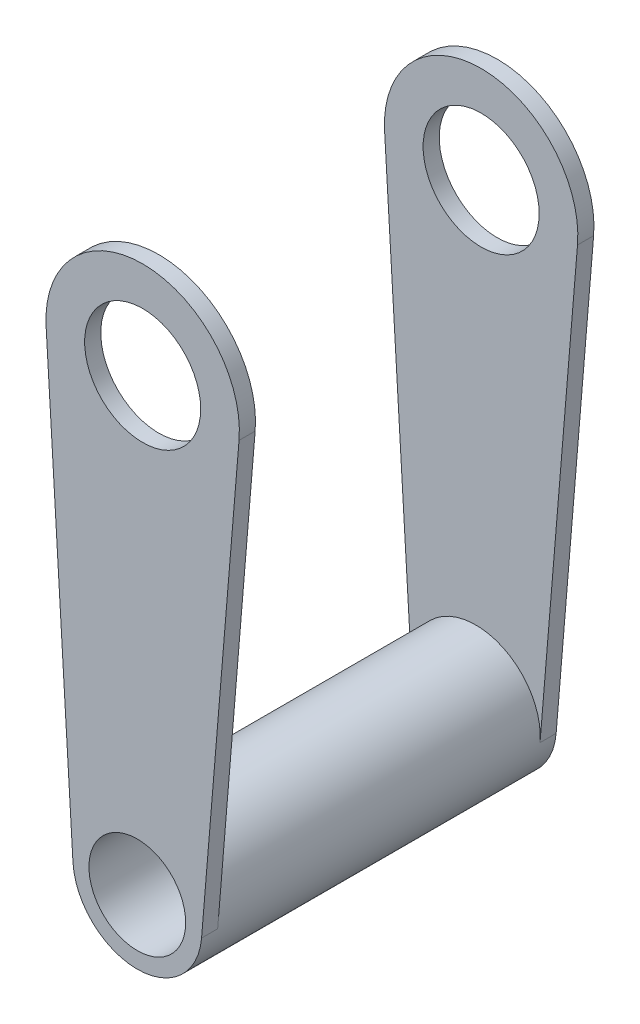
ISO-10303-21;
HEADER;
FILE_DESCRIPTION(('STEP AP214'),'2;1');
FILE_NAME('part.step','',(''),(''),'','','');
FILE_SCHEMA(('AUTOMOTIVE_DESIGN { 1 0 10303 214 1 1 1 1 }'));
ENDSEC;
DATA;
#1=APPLICATION_CONTEXT('core data for automotive mechanical design processes');
#2=APPLICATION_PROTOCOL_DEFINITION('international standard','automotive_design',2000,#1);
#3=PRODUCT_CONTEXT('',#1,'mechanical');
#4=PRODUCT('Part','Part','',(#3));
#5=PRODUCT_RELATED_PRODUCT_CATEGORY('part','',(#4));
#6=PRODUCT_DEFINITION_FORMATION('','',#4);
#7=PRODUCT_DEFINITION_CONTEXT('part definition',#1,'design');
#8=PRODUCT_DEFINITION('design','',#6,#7);
#9=PRODUCT_DEFINITION_SHAPE('','',#8);
#10=(LENGTH_UNIT() NAMED_UNIT(*) SI_UNIT(.MILLI.,.METRE.));
#11=(NAMED_UNIT(*) PLANE_ANGLE_UNIT() SI_UNIT($,.RADIAN.));
#12=(NAMED_UNIT(*) SI_UNIT($,.STERADIAN.) SOLID_ANGLE_UNIT());
#13=UNCERTAINTY_MEASURE_WITH_UNIT(LENGTH_MEASURE(1.E-05),#10,'distance_accuracy_value','');
#14=(GEOMETRIC_REPRESENTATION_CONTEXT(3) GLOBAL_UNCERTAINTY_ASSIGNED_CONTEXT((#13)) GLOBAL_UNIT_ASSIGNED_CONTEXT((#10,
#11,#12)) REPRESENTATION_CONTEXT('',''));
#15=CARTESIAN_POINT('',(0.,0.,0.));
#16=DIRECTION('',(0.,0.,1.));
#17=DIRECTION('',(1.,0.,0.));
#18=AXIS2_PLACEMENT_3D('',#15,#16,#17);
#19=CARTESIAN_POINT('',(146.445745154133,5.9165793374245,-27.5));
#20=DIRECTION('',(0.,0.,1.));
#21=DIRECTION('',(1.,0.,0.));
#22=AXIS2_PLACEMENT_3D('',#19,#20,#21);
#23=CYLINDRICAL_SURFACE('',#22,10.);
#24=DIRECTION('',(0.,0.,1.));
#25=VECTOR('',#24,1.);
#26=CARTESIAN_POINT('',(156.411202736582,5.0861245388871,-27.5));
#27=LINE('',#26,#25);
#28=CARTESIAN_POINT('',(156.411202736582,5.0861245388871,-27.5));
#29=VERTEX_POINT('',#28);
#30=CARTESIAN_POINT('',(156.411202736582,5.0861245388871,-25.));
#31=VERTEX_POINT('',#30);
#32=EDGE_CURVE('E166',#29,#31,#27,.T.);
#33=ORIENTED_EDGE('',*,*,#32,.T.);
#34=CARTESIAN_POINT('',(146.445745154133,5.9165793374245,-25.));
#35=DIRECTION('',(0.,0.,1.));
#36=DIRECTION('',(1.,0.,0.));
#37=AXIS2_PLACEMENT_3D('',#34,#35,#36);
#38=CIRCLE('',#37,10.);
#39=CARTESIAN_POINT('',(136.463425545318,5.32219290801448,-25.));
#40=VERTEX_POINT('',#39);
#41=EDGE_CURVE('E11',#40,#31,#38,.F.);
#42=ORIENTED_EDGE('',*,*,#41,.F.);
#43=DIRECTION('',(0.,0.,1.));
#44=VECTOR('',#43,1.);
#45=CARTESIAN_POINT('',(136.463425545318,5.32219290801447,-27.5));
#46=LINE('',#45,#44);
#47=CARTESIAN_POINT('',(136.463425545318,5.32219290801447,-27.5));
#48=VERTEX_POINT('',#47);
#49=EDGE_CURVE('E169',#48,#40,#46,.T.);
#50=ORIENTED_EDGE('',*,*,#49,.F.);
#51=CARTESIAN_POINT('',(146.445745154133,5.9165793374245,-27.5));
#52=DIRECTION('',(0.,0.,1.));
#53=DIRECTION('',(-1.,0.,0.));
#54=AXIS2_PLACEMENT_3D('',#51,#52,#53);
#55=CIRCLE('',#54,10.);
#56=EDGE_CURVE('E151',#48,#29,#55,.T.);
#57=ORIENTED_EDGE('',*,*,#56,.T.);
#58=EDGE_LOOP('',(#33,#42,#50,#57));
#59=FACE_BOUND('',#58,.T.);
#60=CARTESIAN_POINT('',(146.445745154133,5.9165793374245,25.));
#61=DIRECTION('',(0.,0.,1.));
#62=DIRECTION('',(1.,0.,0.));
#63=AXIS2_PLACEMENT_3D('',#60,#61,#62);
#64=CIRCLE('',#63,10.);
#65=CARTESIAN_POINT('',(136.463425545318,5.32219290801448,25.));
#66=VERTEX_POINT('',#65);
#67=CARTESIAN_POINT('',(156.411202736582,5.0861245388871,25.));
#68=VERTEX_POINT('',#67);
#69=EDGE_CURVE('E123',#66,#68,#64,.F.);
#70=ORIENTED_EDGE('',*,*,#69,.T.);
#71=DIRECTION('',(0.,0.,-1.));
#72=VECTOR('',#71,1.);
#73=CARTESIAN_POINT('',(156.411202736582,5.0861245388871,27.5));
#74=LINE('',#73,#72);
#75=CARTESIAN_POINT('',(156.411202736582,5.0861245388871,27.5));
#76=VERTEX_POINT('',#75);
#77=EDGE_CURVE('E57',#76,#68,#74,.T.);
#78=ORIENTED_EDGE('',*,*,#77,.F.);
#79=CARTESIAN_POINT('',(146.445745154133,5.9165793374245,27.5));
#80=DIRECTION('',(0.,0.,1.));
#81=DIRECTION('',(1.,0.,0.));
#82=AXIS2_PLACEMENT_3D('',#79,#80,#81);
#83=CIRCLE('',#82,10.);
#84=CARTESIAN_POINT('',(136.463425545318,5.32219290801447,27.5));
#85=VERTEX_POINT('',#84);
#86=EDGE_CURVE('E132',#85,#76,#83,.T.);
#87=ORIENTED_EDGE('',*,*,#86,.F.);
#88=DIRECTION('',(0.,0.,-1.));
#89=VECTOR('',#88,1.);
#90=CARTESIAN_POINT('',(136.463425545318,5.32219290801447,27.5));
#91=LINE('',#90,#89);
#92=EDGE_CURVE('E52',#85,#66,#91,.T.);
#93=ORIENTED_EDGE('',*,*,#92,.T.);
#94=EDGE_LOOP('',(#70,#78,#87,#93));
#95=FACE_BOUND('',#94,.T.);
#96=ADVANCED_FACE('F37',(#59,#95),#23,.T.);
#97=CARTESIAN_POINT('',(147.27619995267,76.0900098138348,-25.));
#98=DIRECTION('',(0.,0.,1.));
#99=DIRECTION('',(1.,0.,0.));
#100=AXIS2_PLACEMENT_3D('',#97,#98,#99);
#101=PLANE('',#100);
#102=CARTESIAN_POINT('',(147.27619995267,76.0900098138348,-25.));
#103=DIRECTION('',(0.,0.,1.));
#104=DIRECTION('',(1.,0.,0.));
#105=AXIS2_PLACEMENT_3D('',#102,#103,#104);
#106=CIRCLE('',#105,9.00000000000001);
#107=CARTESIAN_POINT('',(156.27619995267,76.0900098138348,-25.));
#108=VERTEX_POINT('',#107);
#109=EDGE_CURVE('E134',#108,#108,#106,.T.);
#110=ORIENTED_EDGE('',*,*,#109,.F.);
#111=EDGE_LOOP('',(#110));
#112=FACE_BOUND('',#111,.T.);
#113=DIRECTION('',(0.0594386429410018,-0.998231960881504,0.));
#114=VECTOR('',#113,1.);
#115=CARTESIAN_POINT('',(132.302720539448,75.1984301697197,-25.));
#116=LINE('',#115,#114);
#117=CARTESIAN_POINT('',(132.302720539448,75.1984301697197,-25.));
#118=VERTEX_POINT('',#117);
#119=EDGE_CURVE('E160',#118,#40,#116,.T.);
#120=ORIENTED_EDGE('',*,*,#119,.T.);
#121=ORIENTED_EDGE('',*,*,#41,.T.);
#122=DIRECTION('',(0.0830454798537399,0.99654575824488,0.));
#123=VECTOR('',#122,1.);
#124=CARTESIAN_POINT('',(156.411202736582,5.0861245388871,-25.));
#125=LINE('',#124,#123);
#126=CARTESIAN_POINT('',(162.224386326344,74.8443276160287,-25.));
#127=VERTEX_POINT('',#126);
#128=EDGE_CURVE('E148',#31,#127,#125,.T.);
#129=ORIENTED_EDGE('',*,*,#128,.T.);
#130=CARTESIAN_POINT('',(147.27619995267,76.0900098138348,-25.));
#131=DIRECTION('',(0.,0.,1.));
#132=DIRECTION('',(1.,0.,0.));
#133=AXIS2_PLACEMENT_3D('',#130,#131,#132);
#134=CIRCLE('',#133,15.);
#135=EDGE_CURVE('E143',#127,#118,#134,.T.);
#136=ORIENTED_EDGE('',*,*,#135,.T.);
#137=EDGE_LOOP('',(#120,#121,#129,#136));
#138=FACE_BOUND('',#137,.T.);
#139=ADVANCED_FACE('F179',(#112,#138),#101,.T.);
#140=CARTESIAN_POINT('',(147.27619995267,76.0900098138348,-27.5));
#141=DIRECTION('',(0.,0.,1.));
#142=DIRECTION('',(1.,0.,0.));
#143=AXIS2_PLACEMENT_3D('',#140,#141,#142);
#144=CYLINDRICAL_SURFACE('',#143,15.);
#145=ORIENTED_EDGE('',*,*,#135,.F.);
#146=DIRECTION('',(0.,0.,1.));
#147=VECTOR('',#146,1.);
#148=CARTESIAN_POINT('',(162.224386326344,74.8443276160287,-27.5));
#149=LINE('',#148,#147);
#150=CARTESIAN_POINT('',(162.224386326344,74.8443276160287,-27.5));
#151=VERTEX_POINT('',#150);
#152=EDGE_CURVE('E45',#151,#127,#149,.T.);
#153=ORIENTED_EDGE('',*,*,#152,.F.);
#154=CARTESIAN_POINT('',(147.27619995267,76.0900098138348,-27.5));
#155=DIRECTION('',(0.,0.,1.));
#156=DIRECTION('',(1.,0.,0.));
#157=AXIS2_PLACEMENT_3D('',#154,#155,#156);
#158=CIRCLE('',#157,15.);
#159=CARTESIAN_POINT('',(132.302720539448,75.1984301697197,-27.5));
#160=VERTEX_POINT('',#159);
#161=EDGE_CURVE('E144',#151,#160,#158,.T.);
#162=ORIENTED_EDGE('',*,*,#161,.T.);
#163=DIRECTION('',(0.,0.,1.));
#164=VECTOR('',#163,1.);
#165=CARTESIAN_POINT('',(132.302720539448,75.1984301697197,-27.5));
#166=LINE('',#165,#164);
#167=EDGE_CURVE('E157',#160,#118,#166,.T.);
#168=ORIENTED_EDGE('',*,*,#167,.T.);
#169=EDGE_LOOP('',(#145,#153,#162,#168));
#170=FACE_BOUND('',#169,.T.);
#171=ADVANCED_FACE('F39',(#170),#144,.T.);
#172=CARTESIAN_POINT('',(156.411202736582,5.0861245388871,-27.5));
#173=DIRECTION('',(0.99654575824488,-0.0830454798537399,0.));
#174=DIRECTION('',(0.0830454798537399,0.99654575824488,0.));
#175=AXIS2_PLACEMENT_3D('',#172,#173,#174);
#176=PLANE('',#175);
#177=ORIENTED_EDGE('',*,*,#128,.F.);
#178=ORIENTED_EDGE('',*,*,#32,.F.);
#179=DIRECTION('',(0.0830454798537399,0.99654575824488,0.));
#180=VECTOR('',#179,1.);
#181=CARTESIAN_POINT('',(156.411202736582,5.0861245388871,-27.5));
#182=LINE('',#181,#180);
#183=EDGE_CURVE('E154',#29,#151,#182,.T.);
#184=ORIENTED_EDGE('',*,*,#183,.T.);
#185=ORIENTED_EDGE('',*,*,#152,.T.);
#186=EDGE_LOOP('',(#177,#178,#184,#185));
#187=FACE_BOUND('',#186,.T.);
#188=ADVANCED_FACE('F182',(#187),#176,.T.);
#189=CARTESIAN_POINT('',(132.302720539448,75.1984301697197,-27.5));
#190=DIRECTION('',(-0.998231960881504,-0.0594386429410018,0.));
#191=DIRECTION('',(0.0594386429410018,-0.998231960881504,0.));
#192=AXIS2_PLACEMENT_3D('',#189,#190,#191);
#193=PLANE('',#192);
#194=ORIENTED_EDGE('',*,*,#119,.F.);
#195=ORIENTED_EDGE('',*,*,#167,.F.);
#196=DIRECTION('',(0.0594386429410018,-0.998231960881504,0.));
#197=VECTOR('',#196,1.);
#198=CARTESIAN_POINT('',(132.302720539448,75.1984301697197,-27.5));
#199=LINE('',#198,#197);
#200=EDGE_CURVE('E147',#160,#48,#199,.T.);
#201=ORIENTED_EDGE('',*,*,#200,.T.);
#202=ORIENTED_EDGE('',*,*,#49,.T.);
#203=EDGE_LOOP('',(#194,#195,#201,#202));
#204=FACE_BOUND('',#203,.T.);
#205=ADVANCED_FACE('F177',(#204),#193,.T.);
#206=CARTESIAN_POINT('',(147.27619995267,76.0900098138348,-27.5));
#207=DIRECTION('',(0.,0.,1.));
#208=DIRECTION('',(1.,0.,0.));
#209=AXIS2_PLACEMENT_3D('',#206,#207,#208);
#210=PLANE('',#209);
#211=CARTESIAN_POINT('',(146.445745154133,5.9165793374245,-27.5));
#212=DIRECTION('',(0.,0.,1.));
#213=DIRECTION('',(1.,0.,0.));
#214=AXIS2_PLACEMENT_3D('',#211,#212,#213);
#215=CIRCLE('',#214,7.50000000000001);
#216=CARTESIAN_POINT('',(153.945745154133,5.9165793374245,-27.5));
#217=VERTEX_POINT('',#216);
#218=EDGE_CURVE('E138',#217,#217,#215,.T.);
#219=ORIENTED_EDGE('',*,*,#218,.T.);
#220=EDGE_LOOP('',(#219));
#221=FACE_BOUND('',#220,.T.);
#222=ORIENTED_EDGE('',*,*,#56,.F.);
#223=ORIENTED_EDGE('',*,*,#200,.F.);
#224=ORIENTED_EDGE('',*,*,#161,.F.);
#225=ORIENTED_EDGE('',*,*,#183,.F.);
#226=EDGE_LOOP('',(#222,#223,#224,#225));
#227=FACE_BOUND('',#226,.T.);
#228=CARTESIAN_POINT('',(147.27619995267,76.0900098138348,-27.5));
#229=DIRECTION('',(0.,0.,1.));
#230=DIRECTION('',(1.,0.,0.));
#231=AXIS2_PLACEMENT_3D('',#228,#229,#230);
#232=CIRCLE('',#231,9.00000000000001);
#233=CARTESIAN_POINT('',(156.27619995267,76.0900098138348,-27.5));
#234=VERTEX_POINT('',#233);
#235=EDGE_CURVE('E135',#234,#234,#232,.T.);
#236=ORIENTED_EDGE('',*,*,#235,.T.);
#237=EDGE_LOOP('',(#236));
#238=FACE_BOUND('',#237,.T.);
#239=ADVANCED_FACE('F186',(#221,#227,#238),#210,.F.);
#240=CARTESIAN_POINT('',(146.445745154133,5.9165793374245,-27.5));
#241=DIRECTION('',(0.,0.,1.));
#242=DIRECTION('',(1.,0.,0.));
#243=AXIS2_PLACEMENT_3D('',#240,#241,#242);
#244=CYLINDRICAL_SURFACE('',#243,7.50000000000001);
#245=CARTESIAN_POINT('',(146.445745154133,5.9165793374245,27.5));
#246=DIRECTION('',(0.,0.,1.));
#247=DIRECTION('',(1.,0.,0.));
#248=AXIS2_PLACEMENT_3D('',#245,#246,#247);
#249=CIRCLE('',#248,7.50000000000001);
#250=CARTESIAN_POINT('',(153.945745154133,5.9165793374245,27.5));
#251=VERTEX_POINT('',#250);
#252=EDGE_CURVE('E125',#251,#251,#249,.T.);
#253=ORIENTED_EDGE('',*,*,#252,.T.);
#254=EDGE_LOOP('',(#253));
#255=FACE_BOUND('',#254,.T.);
#256=ORIENTED_EDGE('',*,*,#218,.F.);
#257=EDGE_LOOP('',(#256));
#258=FACE_BOUND('',#257,.T.);
#259=ADVANCED_FACE('F233',(#255,#258),#244,.F.);
#260=CARTESIAN_POINT('',(147.27619995267,76.0900098138348,-27.5));
#261=DIRECTION('',(0.,0.,1.));
#262=DIRECTION('',(1.,0.,0.));
#263=AXIS2_PLACEMENT_3D('',#260,#261,#262);
#264=CYLINDRICAL_SURFACE('',#263,9.00000000000001);
#265=ORIENTED_EDGE('',*,*,#235,.F.);
#266=EDGE_LOOP('',(#265));
#267=FACE_BOUND('',#266,.T.);
#268=ORIENTED_EDGE('',*,*,#109,.T.);
#269=EDGE_LOOP('',(#268));
#270=FACE_BOUND('',#269,.T.);
#271=ADVANCED_FACE('F230',(#267,#270),#264,.F.);
#272=CARTESIAN_POINT('',(146.445745154133,5.9165793374245,27.5));
#273=DIRECTION('',(0.,0.,1.));
#274=DIRECTION('',(1.,0.,0.));
#275=AXIS2_PLACEMENT_3D('',#272,#273,#274);
#276=PLANE('',#275);
#277=ORIENTED_EDGE('',*,*,#86,.T.);
#278=DIRECTION('',(0.0830454798537399,0.99654575824488,0.));
#279=VECTOR('',#278,1.);
#280=CARTESIAN_POINT('',(156.411202736582,5.0861245388871,27.5));
#281=LINE('',#280,#279);
#282=CARTESIAN_POINT('',(162.224386326344,74.8443276160287,27.5));
#283=VERTEX_POINT('',#282);
#284=EDGE_CURVE('E108',#76,#283,#281,.T.);
#285=ORIENTED_EDGE('',*,*,#284,.T.);
#286=CARTESIAN_POINT('',(147.27619995267,76.0900098138348,27.5));
#287=DIRECTION('',(0.,0.,1.));
#288=DIRECTION('',(1.,0.,0.));
#289=AXIS2_PLACEMENT_3D('',#286,#287,#288);
#290=CIRCLE('',#289,15.);
#291=CARTESIAN_POINT('',(132.302720539448,75.1984301697197,27.5));
#292=VERTEX_POINT('',#291);
#293=EDGE_CURVE('E109',#283,#292,#290,.T.);
#294=ORIENTED_EDGE('',*,*,#293,.T.);
#295=DIRECTION('',(0.0594386429410018,-0.998231960881504,0.));
#296=VECTOR('',#295,1.);
#297=CARTESIAN_POINT('',(132.302720539448,75.1984301697197,27.5));
#298=LINE('',#297,#296);
#299=EDGE_CURVE('E100',#292,#85,#298,.T.);
#300=ORIENTED_EDGE('',*,*,#299,.T.);
#301=EDGE_LOOP('',(#277,#285,#294,#300));
#302=FACE_BOUND('',#301,.T.);
#303=ORIENTED_EDGE('',*,*,#252,.F.);
#304=EDGE_LOOP('',(#303));
#305=FACE_BOUND('',#304,.T.);
#306=CARTESIAN_POINT('',(147.27619995267,76.0900098138348,27.5));
#307=DIRECTION('',(0.,0.,1.));
#308=DIRECTION('',(1.,0.,0.));
#309=AXIS2_PLACEMENT_3D('',#306,#307,#308);
#310=CIRCLE('',#309,9.00000000000001);
#311=CARTESIAN_POINT('',(156.27619995267,76.0900098138348,27.5));
#312=VERTEX_POINT('',#311);
#313=EDGE_CURVE('E204',#312,#312,#310,.T.);
#314=ORIENTED_EDGE('',*,*,#313,.F.);
#315=EDGE_LOOP('',(#314));
#316=FACE_BOUND('',#315,.T.);
#317=ADVANCED_FACE('F112',(#302,#305,#316),#276,.T.);
#318=CARTESIAN_POINT('',(147.27619995267,76.0900098138348,25.));
#319=DIRECTION('',(0.,0.,1.));
#320=DIRECTION('',(1.,0.,0.));
#321=AXIS2_PLACEMENT_3D('',#318,#319,#320);
#322=PLANE('',#321);
#323=ORIENTED_EDGE('',*,*,#69,.F.);
#324=DIRECTION('',(0.0594386429410018,-0.998231960881504,0.));
#325=VECTOR('',#324,1.);
#326=CARTESIAN_POINT('',(132.302720539448,75.1984301697197,25.));
#327=LINE('',#326,#325);
#328=CARTESIAN_POINT('',(132.302720539448,75.1984301697197,25.));
#329=VERTEX_POINT('',#328);
#330=EDGE_CURVE('E198',#329,#66,#327,.T.);
#331=ORIENTED_EDGE('',*,*,#330,.F.);
#332=CARTESIAN_POINT('',(147.27619995267,76.0900098138348,25.));
#333=DIRECTION('',(0.,0.,1.));
#334=DIRECTION('',(1.,0.,0.));
#335=AXIS2_PLACEMENT_3D('',#332,#333,#334);
#336=CIRCLE('',#335,15.);
#337=CARTESIAN_POINT('',(162.224386326344,74.8443276160287,25.));
#338=VERTEX_POINT('',#337);
#339=EDGE_CURVE('E122',#338,#329,#336,.T.);
#340=ORIENTED_EDGE('',*,*,#339,.F.);
#341=DIRECTION('',(0.0830454798537399,0.99654575824488,0.));
#342=VECTOR('',#341,1.);
#343=CARTESIAN_POINT('',(156.411202736582,5.0861245388871,25.));
#344=LINE('',#343,#342);
#345=EDGE_CURVE('E118',#68,#338,#344,.T.);
#346=ORIENTED_EDGE('',*,*,#345,.F.);
#347=EDGE_LOOP('',(#323,#331,#340,#346));
#348=FACE_BOUND('',#347,.T.);
#349=CARTESIAN_POINT('',(147.27619995267,76.0900098138348,25.));
#350=DIRECTION('',(0.,0.,1.));
#351=DIRECTION('',(1.,0.,0.));
#352=AXIS2_PLACEMENT_3D('',#349,#350,#351);
#353=CIRCLE('',#352,9.00000000000001);
#354=CARTESIAN_POINT('',(156.27619995267,76.0900098138348,25.));
#355=VERTEX_POINT('',#354);
#356=EDGE_CURVE('E206',#355,#355,#353,.T.);
#357=ORIENTED_EDGE('',*,*,#356,.T.);
#358=EDGE_LOOP('',(#357));
#359=FACE_BOUND('',#358,.T.);
#360=ADVANCED_FACE('F196',(#348,#359),#322,.F.);
#361=CARTESIAN_POINT('',(147.27619995267,76.0900098138348,27.5));
#362=DIRECTION('',(0.,0.,-1.));
#363=DIRECTION('',(-1.,0.,0.));
#364=AXIS2_PLACEMENT_3D('',#361,#362,#363);
#365=CYLINDRICAL_SURFACE('',#364,15.);
#366=ORIENTED_EDGE('',*,*,#339,.T.);
#367=DIRECTION('',(0.,0.,-1.));
#368=VECTOR('',#367,1.);
#369=CARTESIAN_POINT('',(132.302720539448,75.1984301697197,27.5));
#370=LINE('',#369,#368);
#371=EDGE_CURVE('E105',#292,#329,#370,.T.);
#372=ORIENTED_EDGE('',*,*,#371,.F.);
#373=ORIENTED_EDGE('',*,*,#293,.F.);
#374=DIRECTION('',(0.,0.,-1.));
#375=VECTOR('',#374,1.);
#376=CARTESIAN_POINT('',(162.224386326344,74.8443276160287,27.5));
#377=LINE('',#376,#375);
#378=EDGE_CURVE('E195',#283,#338,#377,.T.);
#379=ORIENTED_EDGE('',*,*,#378,.T.);
#380=EDGE_LOOP('',(#366,#372,#373,#379));
#381=FACE_BOUND('',#380,.T.);
#382=ADVANCED_FACE('F120',(#381),#365,.T.);
#383=CARTESIAN_POINT('',(132.302720539448,75.1984301697197,27.5));
#384=DIRECTION('',(0.998231960881504,0.0594386429410018,0.));
#385=DIRECTION('',(-0.0594386429410018,0.998231960881504,0.));
#386=AXIS2_PLACEMENT_3D('',#383,#384,#385);
#387=PLANE('',#386);
#388=ORIENTED_EDGE('',*,*,#330,.T.);
#389=ORIENTED_EDGE('',*,*,#92,.F.);
#390=ORIENTED_EDGE('',*,*,#299,.F.);
#391=ORIENTED_EDGE('',*,*,#371,.T.);
#392=EDGE_LOOP('',(#388,#389,#390,#391));
#393=FACE_BOUND('',#392,.T.);
#394=ADVANCED_FACE('F103',(#393),#387,.F.);
#395=CARTESIAN_POINT('',(156.411202736582,5.0861245388871,27.5));
#396=DIRECTION('',(-0.99654575824488,0.0830454798537399,0.));
#397=DIRECTION('',(-0.0830454798537399,-0.99654575824488,0.));
#398=AXIS2_PLACEMENT_3D('',#395,#396,#397);
#399=PLANE('',#398);
#400=ORIENTED_EDGE('',*,*,#345,.T.);
#401=ORIENTED_EDGE('',*,*,#378,.F.);
#402=ORIENTED_EDGE('',*,*,#284,.F.);
#403=ORIENTED_EDGE('',*,*,#77,.T.);
#404=EDGE_LOOP('',(#400,#401,#402,#403));
#405=FACE_BOUND('',#404,.T.);
#406=ADVANCED_FACE('F194',(#405),#399,.F.);
#407=CARTESIAN_POINT('',(147.27619995267,76.0900098138348,27.5));
#408=DIRECTION('',(0.,0.,-1.));
#409=DIRECTION('',(-1.,0.,0.));
#410=AXIS2_PLACEMENT_3D('',#407,#408,#409);
#411=CYLINDRICAL_SURFACE('',#410,9.00000000000001);
#412=ORIENTED_EDGE('',*,*,#313,.T.);
#413=EDGE_LOOP('',(#412));
#414=FACE_BOUND('',#413,.T.);
#415=ORIENTED_EDGE('',*,*,#356,.F.);
#416=EDGE_LOOP('',(#415));
#417=FACE_BOUND('',#416,.T.);
#418=ADVANCED_FACE('F214',(#414,#417),#411,.F.);
#419=CLOSED_SHELL('',(#96,#139,#171,#188,#205,#239,#259,#271,#317,#360,#382,#394,#406,#418));
#420=MANIFOLD_SOLID_BREP('B2',#419);
#421=ADVANCED_BREP_SHAPE_REPRESENTATION('',(#18,#420),#14);
#422=SHAPE_DEFINITION_REPRESENTATION(#9,#421);
ENDSEC;
END-ISO-10303-21;
